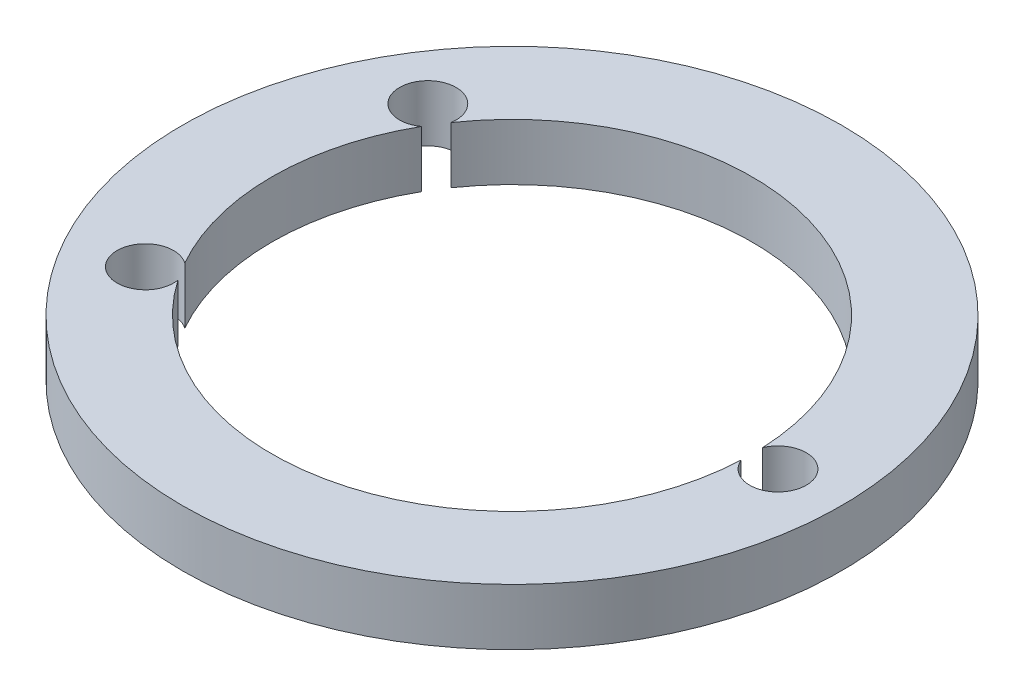
ISO-10303-21;
HEADER;
FILE_DESCRIPTION(('STEP AP214'),'2;1');
FILE_NAME('part.step','',(''),(''),'','','');
FILE_SCHEMA(('AUTOMOTIVE_DESIGN { 1 0 10303 214 1 1 1 1 }'));
ENDSEC;
DATA;
#1=APPLICATION_CONTEXT('core data for automotive mechanical design processes');
#2=APPLICATION_PROTOCOL_DEFINITION('international standard','automotive_design',2000,#1);
#3=PRODUCT_CONTEXT('',#1,'mechanical');
#4=PRODUCT('Part','Part','',(#3));
#5=PRODUCT_RELATED_PRODUCT_CATEGORY('part','',(#4));
#6=PRODUCT_DEFINITION_FORMATION('','',#4);
#7=PRODUCT_DEFINITION_CONTEXT('part definition',#1,'design');
#8=PRODUCT_DEFINITION('design','',#6,#7);
#9=PRODUCT_DEFINITION_SHAPE('','',#8);
#10=(LENGTH_UNIT() NAMED_UNIT(*) SI_UNIT(.MILLI.,.METRE.));
#11=(NAMED_UNIT(*) PLANE_ANGLE_UNIT() SI_UNIT($,.RADIAN.));
#12=(NAMED_UNIT(*) SI_UNIT($,.STERADIAN.) SOLID_ANGLE_UNIT());
#13=UNCERTAINTY_MEASURE_WITH_UNIT(LENGTH_MEASURE(1.E-05),#10,'distance_accuracy_value','');
#14=(GEOMETRIC_REPRESENTATION_CONTEXT(3) GLOBAL_UNCERTAINTY_ASSIGNED_CONTEXT((#13)) GLOBAL_UNIT_ASSIGNED_CONTEXT((#10,
#11,#12)) REPRESENTATION_CONTEXT('',''));
#15=CARTESIAN_POINT('',(0.,0.,0.));
#16=DIRECTION('',(0.,0.,1.));
#17=DIRECTION('',(1.,0.,0.));
#18=AXIS2_PLACEMENT_3D('',#15,#16,#17);
#19=CARTESIAN_POINT('',(0.,6.,0.));
#20=DIRECTION('',(0.,1.,0.));
#21=DIRECTION('',(0.,0.,1.));
#22=AXIS2_PLACEMENT_3D('',#19,#20,#21);
#23=PLANE('',#22);
#24=CARTESIAN_POINT('',(0.,6.,0.));
#25=DIRECTION('',(0.,1.,0.));
#26=DIRECTION('',(0.,0.,1.));
#27=AXIS2_PLACEMENT_3D('',#24,#25,#26);
#28=CIRCLE('',#27,35.);
#29=CARTESIAN_POINT('',(0.,6.,35.));
#30=VERTEX_POINT('',#29);
#31=EDGE_CURVE('E11',#30,#30,#28,.T.);
#32=ORIENTED_EDGE('',*,*,#31,.T.);
#33=EDGE_LOOP('',(#32));
#34=FACE_BOUND('',#33,.T.);
#35=CARTESIAN_POINT('',(-23.9387238590531,6.,-15.));
#36=DIRECTION('',(0.,1.,0.));
#37=DIRECTION('',(0.,0.,1.));
#38=AXIS2_PLACEMENT_3D('',#35,#36,#37);
#39=CIRCLE('',#38,3.);
#40=CARTESIAN_POINT('',(-20.9821608805359,6.,-14.4913396476415));
#41=VERTEX_POINT('',#40);
#42=CARTESIAN_POINT('',(-22.1915310099907,6.,-12.5612878094812));
#43=VERTEX_POINT('',#42);
#44=EDGE_CURVE('E95',#41,#43,#39,.T.);
#45=ORIENTED_EDGE('',*,*,#44,.F.);
#46=CARTESIAN_POINT('',(0.,6.,0.));
#47=DIRECTION('',(0.,1.,0.));
#48=DIRECTION('',(0.,0.,1.));
#49=AXIS2_PLACEMENT_3D('',#46,#47,#48);
#50=CIRCLE('',#49,25.5);
#51=CARTESIAN_POINT('',(25.4745575221239,6.,-1.13882353856992));
#52=VERTEX_POINT('',#51);
#53=EDGE_CURVE('E87',#52,#41,#50,.T.);
#54=ORIENTED_EDGE('',*,*,#53,.F.);
#55=CARTESIAN_POINT('',(28.25,6.,0.));
#56=DIRECTION('',(0.,1.,0.));
#57=DIRECTION('',(0.,0.,1.));
#58=AXIS2_PLACEMENT_3D('',#55,#56,#57);
#59=CIRCLE('',#58,3.);
#60=CARTESIAN_POINT('',(25.4745575221239,6.,1.13882353856992));
#61=VERTEX_POINT('',#60);
#62=EDGE_CURVE('E115',#61,#52,#59,.T.);
#63=ORIENTED_EDGE('',*,*,#62,.F.);
#64=CARTESIAN_POINT('',(0.,6.,0.));
#65=DIRECTION('',(0.,1.,0.));
#66=DIRECTION('',(0.,0.,1.));
#67=AXIS2_PLACEMENT_3D('',#64,#65,#66);
#68=CIRCLE('',#67,25.5);
#69=CARTESIAN_POINT('',(-20.9821608805359,6.,14.4913396476415));
#70=VERTEX_POINT('',#69);
#71=EDGE_CURVE('E113',#70,#61,#68,.T.);
#72=ORIENTED_EDGE('',*,*,#71,.F.);
#73=CARTESIAN_POINT('',(-23.9387238590531,6.,15.));
#74=DIRECTION('',(0.,1.,0.));
#75=DIRECTION('',(0.,0.,-1.));
#76=AXIS2_PLACEMENT_3D('',#73,#74,#75);
#77=CIRCLE('',#76,3.);
#78=CARTESIAN_POINT('',(-22.1915310099907,6.,12.5612878094812));
#79=VERTEX_POINT('',#78);
#80=EDGE_CURVE('E109',#79,#70,#77,.T.);
#81=ORIENTED_EDGE('',*,*,#80,.F.);
#82=CARTESIAN_POINT('',(0.,6.,0.));
#83=DIRECTION('',(0.,1.,0.));
#84=DIRECTION('',(0.,0.,1.));
#85=AXIS2_PLACEMENT_3D('',#82,#83,#84);
#86=CIRCLE('',#85,25.5);
#87=EDGE_CURVE('E107',#43,#79,#86,.T.);
#88=ORIENTED_EDGE('',*,*,#87,.F.);
#89=EDGE_LOOP('',(#45,#54,#63,#72,#81,#88));
#90=FACE_BOUND('',#89,.T.);
#91=ADVANCED_FACE('F34',(#34,#90),#23,.T.);
#92=CARTESIAN_POINT('',(0.,0.,0.));
#93=DIRECTION('',(0.,1.,0.));
#94=DIRECTION('',(0.,0.,1.));
#95=AXIS2_PLACEMENT_3D('',#92,#93,#94);
#96=PLANE('',#95);
#97=CARTESIAN_POINT('',(0.,0.,0.));
#98=DIRECTION('',(0.,1.,0.));
#99=DIRECTION('',(0.,0.,1.));
#100=AXIS2_PLACEMENT_3D('',#97,#98,#99);
#101=CIRCLE('',#100,35.);
#102=CARTESIAN_POINT('',(0.,0.,35.));
#103=VERTEX_POINT('',#102);
#104=EDGE_CURVE('E38',#103,#103,#101,.T.);
#105=ORIENTED_EDGE('',*,*,#104,.F.);
#106=EDGE_LOOP('',(#105));
#107=FACE_BOUND('',#106,.T.);
#108=CARTESIAN_POINT('',(0.,0.,0.));
#109=DIRECTION('',(0.,1.,0.));
#110=DIRECTION('',(0.,0.,1.));
#111=AXIS2_PLACEMENT_3D('',#108,#109,#110);
#112=CIRCLE('',#111,25.5);
#113=CARTESIAN_POINT('',(25.4745575221239,0.,-1.13882353856992));
#114=VERTEX_POINT('',#113);
#115=CARTESIAN_POINT('',(-20.9821608805359,0.,-14.4913396476415));
#116=VERTEX_POINT('',#115);
#117=EDGE_CURVE('E57',#114,#116,#112,.T.);
#118=ORIENTED_EDGE('',*,*,#117,.T.);
#119=CARTESIAN_POINT('',(-23.9387238590531,0.,-15.));
#120=DIRECTION('',(0.,1.,0.));
#121=DIRECTION('',(0.,0.,1.));
#122=AXIS2_PLACEMENT_3D('',#119,#120,#121);
#123=CIRCLE('',#122,3.);
#124=CARTESIAN_POINT('',(-22.1915310099907,0.,-12.5612878094812));
#125=VERTEX_POINT('',#124);
#126=EDGE_CURVE('E102',#116,#125,#123,.T.);
#127=ORIENTED_EDGE('',*,*,#126,.T.);
#128=CARTESIAN_POINT('',(0.,0.,0.));
#129=DIRECTION('',(0.,1.,0.));
#130=DIRECTION('',(0.,0.,1.));
#131=AXIS2_PLACEMENT_3D('',#128,#129,#130);
#132=CIRCLE('',#131,25.5);
#133=CARTESIAN_POINT('',(-22.1915310099907,0.,12.5612878094812));
#134=VERTEX_POINT('',#133);
#135=EDGE_CURVE('E119',#125,#134,#132,.T.);
#136=ORIENTED_EDGE('',*,*,#135,.T.);
#137=CARTESIAN_POINT('',(-23.9387238590531,0.,15.));
#138=DIRECTION('',(0.,1.,0.));
#139=DIRECTION('',(0.,0.,-1.));
#140=AXIS2_PLACEMENT_3D('',#137,#138,#139);
#141=CIRCLE('',#140,3.);
#142=CARTESIAN_POINT('',(-20.9821608805359,0.,14.4913396476415));
#143=VERTEX_POINT('',#142);
#144=EDGE_CURVE('E122',#134,#143,#141,.T.);
#145=ORIENTED_EDGE('',*,*,#144,.T.);
#146=CARTESIAN_POINT('',(0.,0.,0.));
#147=DIRECTION('',(0.,1.,0.));
#148=DIRECTION('',(0.,0.,1.));
#149=AXIS2_PLACEMENT_3D('',#146,#147,#148);
#150=CIRCLE('',#149,25.5);
#151=CARTESIAN_POINT('',(25.4745575221239,0.,1.13882353856992));
#152=VERTEX_POINT('',#151);
#153=EDGE_CURVE('E125',#143,#152,#150,.T.);
#154=ORIENTED_EDGE('',*,*,#153,.T.);
#155=CARTESIAN_POINT('',(28.25,0.,0.));
#156=DIRECTION('',(0.,1.,0.));
#157=DIRECTION('',(0.,0.,1.));
#158=AXIS2_PLACEMENT_3D('',#155,#156,#157);
#159=CIRCLE('',#158,3.);
#160=EDGE_CURVE('E96',#152,#114,#159,.T.);
#161=ORIENTED_EDGE('',*,*,#160,.T.);
#162=EDGE_LOOP('',(#118,#127,#136,#145,#154,#161));
#163=FACE_BOUND('',#162,.T.);
#164=ADVANCED_FACE('F142',(#107,#163),#96,.F.);
#165=CARTESIAN_POINT('',(0.,6.,0.));
#166=DIRECTION('',(0.,-1.,0.));
#167=DIRECTION('',(0.,0.,-1.));
#168=AXIS2_PLACEMENT_3D('',#165,#166,#167);
#169=CYLINDRICAL_SURFACE('',#168,35.);
#170=ORIENTED_EDGE('',*,*,#31,.F.);
#171=EDGE_LOOP('',(#170));
#172=FACE_BOUND('',#171,.T.);
#173=ORIENTED_EDGE('',*,*,#104,.T.);
#174=EDGE_LOOP('',(#173));
#175=FACE_BOUND('',#174,.T.);
#176=ADVANCED_FACE('F36',(#172,#175),#169,.T.);
#177=CARTESIAN_POINT('',(0.,6.,0.));
#178=DIRECTION('',(0.,-1.,0.));
#179=DIRECTION('',(0.,0.,-1.));
#180=AXIS2_PLACEMENT_3D('',#177,#178,#179);
#181=CYLINDRICAL_SURFACE('',#180,25.5);
#182=ORIENTED_EDGE('',*,*,#117,.F.);
#183=DIRECTION('',(0.,-1.,0.));
#184=VECTOR('',#183,1.);
#185=CARTESIAN_POINT('',(25.4745575221239,6.,-1.13882353856992));
#186=LINE('',#185,#184);
#187=EDGE_CURVE('E91',#52,#114,#186,.T.);
#188=ORIENTED_EDGE('',*,*,#187,.F.);
#189=ORIENTED_EDGE('',*,*,#53,.T.);
#190=DIRECTION('',(0.,-1.,0.));
#191=VECTOR('',#190,1.);
#192=CARTESIAN_POINT('',(-20.9821608805359,6.,-14.4913396476415));
#193=LINE('',#192,#191);
#194=EDGE_CURVE('E90',#41,#116,#193,.T.);
#195=ORIENTED_EDGE('',*,*,#194,.T.);
#196=EDGE_LOOP('',(#182,#188,#189,#195));
#197=FACE_BOUND('',#196,.T.);
#198=ADVANCED_FACE('F89',(#197),#181,.F.);
#199=CARTESIAN_POINT('',(-23.9387238590531,6.,-15.));
#200=DIRECTION('',(0.,-1.,0.));
#201=DIRECTION('',(0.,0.,-1.));
#202=AXIS2_PLACEMENT_3D('',#199,#200,#201);
#203=CYLINDRICAL_SURFACE('',#202,3.);
#204=ORIENTED_EDGE('',*,*,#126,.F.);
#205=ORIENTED_EDGE('',*,*,#194,.F.);
#206=ORIENTED_EDGE('',*,*,#44,.T.);
#207=DIRECTION('',(0.,-1.,0.));
#208=VECTOR('',#207,1.);
#209=CARTESIAN_POINT('',(-22.1915310099907,6.,-12.5612878094812));
#210=LINE('',#209,#208);
#211=EDGE_CURVE('E103',#43,#125,#210,.T.);
#212=ORIENTED_EDGE('',*,*,#211,.T.);
#213=EDGE_LOOP('',(#204,#205,#206,#212));
#214=FACE_BOUND('',#213,.T.);
#215=ADVANCED_FACE('F99',(#214),#203,.F.);
#216=CARTESIAN_POINT('',(0.,6.,0.));
#217=DIRECTION('',(0.,-1.,0.));
#218=DIRECTION('',(0.,0.,-1.));
#219=AXIS2_PLACEMENT_3D('',#216,#217,#218);
#220=CYLINDRICAL_SURFACE('',#219,25.5);
#221=ORIENTED_EDGE('',*,*,#135,.F.);
#222=ORIENTED_EDGE('',*,*,#211,.F.);
#223=ORIENTED_EDGE('',*,*,#87,.T.);
#224=DIRECTION('',(0.,-1.,0.));
#225=VECTOR('',#224,1.);
#226=CARTESIAN_POINT('',(-22.1915310099907,6.,12.5612878094812));
#227=LINE('',#226,#225);
#228=EDGE_CURVE('E134',#79,#134,#227,.T.);
#229=ORIENTED_EDGE('',*,*,#228,.T.);
#230=EDGE_LOOP('',(#221,#222,#223,#229));
#231=FACE_BOUND('',#230,.T.);
#232=ADVANCED_FACE('F138',(#231),#220,.F.);
#233=CARTESIAN_POINT('',(-23.9387238590531,6.,15.));
#234=DIRECTION('',(0.,-1.,0.));
#235=DIRECTION('',(0.,0.,-1.));
#236=AXIS2_PLACEMENT_3D('',#233,#234,#235);
#237=CYLINDRICAL_SURFACE('',#236,3.);
#238=ORIENTED_EDGE('',*,*,#144,.F.);
#239=ORIENTED_EDGE('',*,*,#228,.F.);
#240=ORIENTED_EDGE('',*,*,#80,.T.);
#241=DIRECTION('',(0.,-1.,0.));
#242=VECTOR('',#241,1.);
#243=CARTESIAN_POINT('',(-20.9821608805359,6.,14.4913396476415));
#244=LINE('',#243,#242);
#245=EDGE_CURVE('E132',#70,#143,#244,.T.);
#246=ORIENTED_EDGE('',*,*,#245,.T.);
#247=EDGE_LOOP('',(#238,#239,#240,#246));
#248=FACE_BOUND('',#247,.T.);
#249=ADVANCED_FACE('F150',(#248),#237,.F.);
#250=CARTESIAN_POINT('',(0.,6.,0.));
#251=DIRECTION('',(0.,-1.,0.));
#252=DIRECTION('',(0.,0.,-1.));
#253=AXIS2_PLACEMENT_3D('',#250,#251,#252);
#254=CYLINDRICAL_SURFACE('',#253,25.5);
#255=ORIENTED_EDGE('',*,*,#153,.F.);
#256=ORIENTED_EDGE('',*,*,#245,.F.);
#257=ORIENTED_EDGE('',*,*,#71,.T.);
#258=DIRECTION('',(0.,-1.,0.));
#259=VECTOR('',#258,1.);
#260=CARTESIAN_POINT('',(25.4745575221239,6.,1.13882353856992));
#261=LINE('',#260,#259);
#262=EDGE_CURVE('E49',#61,#152,#261,.T.);
#263=ORIENTED_EDGE('',*,*,#262,.T.);
#264=EDGE_LOOP('',(#255,#256,#257,#263));
#265=FACE_BOUND('',#264,.T.);
#266=ADVANCED_FACE('F148',(#265),#254,.F.);
#267=CARTESIAN_POINT('',(28.25,6.,0.));
#268=DIRECTION('',(0.,-1.,0.));
#269=DIRECTION('',(0.,0.,-1.));
#270=AXIS2_PLACEMENT_3D('',#267,#268,#269);
#271=CYLINDRICAL_SURFACE('',#270,3.);
#272=ORIENTED_EDGE('',*,*,#160,.F.);
#273=ORIENTED_EDGE('',*,*,#262,.F.);
#274=ORIENTED_EDGE('',*,*,#62,.T.);
#275=ORIENTED_EDGE('',*,*,#187,.T.);
#276=EDGE_LOOP('',(#272,#273,#274,#275));
#277=FACE_BOUND('',#276,.T.);
#278=ADVANCED_FACE('F144',(#277),#271,.F.);
#279=CLOSED_SHELL('',(#91,#164,#176,#198,#215,#232,#249,#266,#278));
#280=MANIFOLD_SOLID_BREP('B2',#279);
#281=ADVANCED_BREP_SHAPE_REPRESENTATION('',(#18,#280),#14);
#282=SHAPE_DEFINITION_REPRESENTATION(#9,#281);
ENDSEC;
END-ISO-10303-21;
